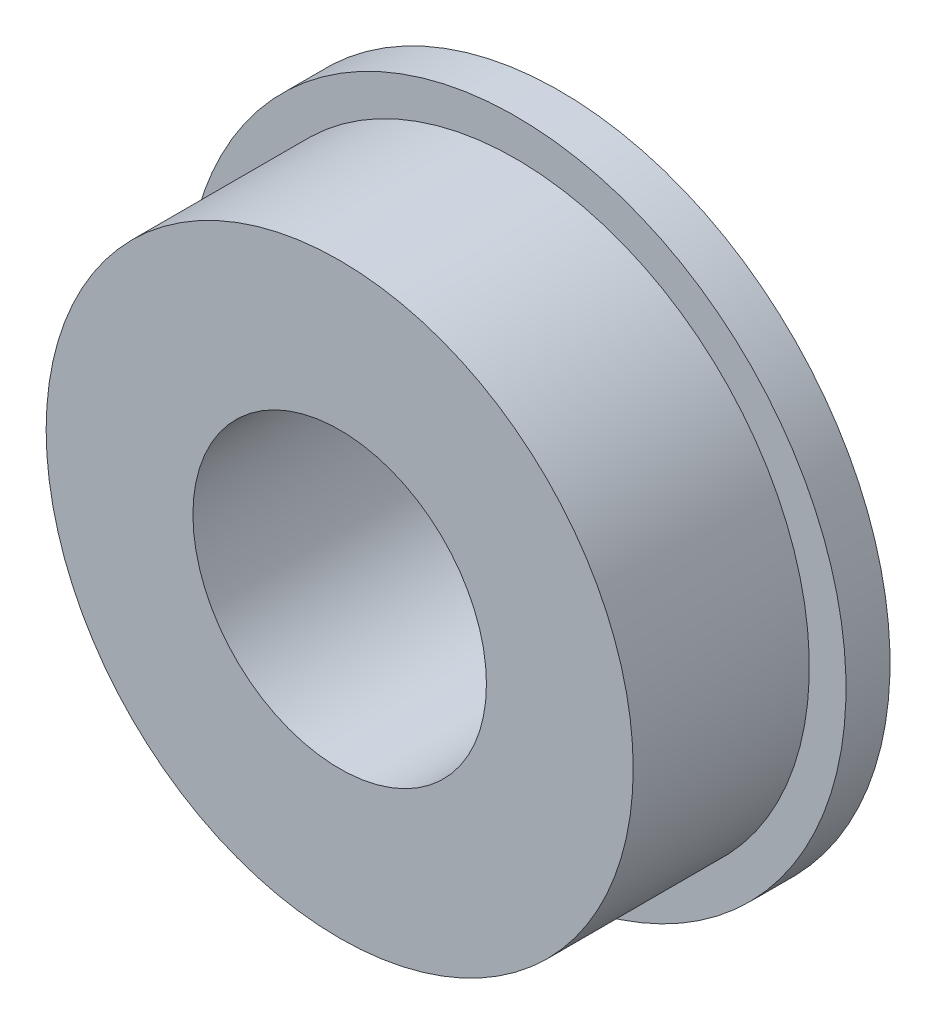
ISO-10303-21;
HEADER;
FILE_DESCRIPTION(('STEP AP214'),'2;1');
FILE_NAME('part.step','',(''),(''),'','','');
FILE_SCHEMA(('AUTOMOTIVE_DESIGN { 1 0 10303 214 1 1 1 1 }'));
ENDSEC;
DATA;
#1=APPLICATION_CONTEXT('core data for automotive mechanical design processes');
#2=APPLICATION_PROTOCOL_DEFINITION('international standard','automotive_design',2000,#1);
#3=PRODUCT_CONTEXT('',#1,'mechanical');
#4=PRODUCT('Part','Part','',(#3));
#5=PRODUCT_RELATED_PRODUCT_CATEGORY('part','',(#4));
#6=PRODUCT_DEFINITION_FORMATION('','',#4);
#7=PRODUCT_DEFINITION_CONTEXT('part definition',#1,'design');
#8=PRODUCT_DEFINITION('design','',#6,#7);
#9=PRODUCT_DEFINITION_SHAPE('','',#8);
#10=(LENGTH_UNIT() NAMED_UNIT(*) SI_UNIT(.MILLI.,.METRE.));
#11=(NAMED_UNIT(*) PLANE_ANGLE_UNIT() SI_UNIT($,.RADIAN.));
#12=(NAMED_UNIT(*) SI_UNIT($,.STERADIAN.) SOLID_ANGLE_UNIT());
#13=UNCERTAINTY_MEASURE_WITH_UNIT(LENGTH_MEASURE(1.E-05),#10,'distance_accuracy_value','');
#14=(GEOMETRIC_REPRESENTATION_CONTEXT(3) GLOBAL_UNCERTAINTY_ASSIGNED_CONTEXT((#13)) GLOBAL_UNIT_ASSIGNED_CONTEXT((#10,
#11,#12)) REPRESENTATION_CONTEXT('',''));
#15=CARTESIAN_POINT('',(0.,0.,0.));
#16=DIRECTION('',(0.,0.,1.));
#17=DIRECTION('',(1.,0.,0.));
#18=AXIS2_PLACEMENT_3D('',#15,#16,#17);
#19=CARTESIAN_POINT('',(0.,0.,3.));
#20=DIRECTION('',(0.,0.,-1.));
#21=DIRECTION('',(-1.,0.,0.));
#22=AXIS2_PLACEMENT_3D('',#19,#20,#21);
#23=CYLINDRICAL_SURFACE('',#22,4.);
#24=CARTESIAN_POINT('',(0.,0.,3.));
#25=DIRECTION('',(0.,0.,1.));
#26=DIRECTION('',(1.,0.,0.));
#27=AXIS2_PLACEMENT_3D('',#24,#25,#26);
#28=CIRCLE('',#27,4.);
#29=CARTESIAN_POINT('',(4.,0.,3.));
#30=VERTEX_POINT('',#29);
#31=EDGE_CURVE('E46',#30,#30,#28,.T.);
#32=ORIENTED_EDGE('',*,*,#31,.F.);
#33=EDGE_LOOP('',(#32));
#34=FACE_BOUND('',#33,.T.);
#35=CARTESIAN_POINT('',(0.,0.,0.6));
#36=DIRECTION('',(0.,0.,-1.));
#37=DIRECTION('',(-1.,0.,0.));
#38=AXIS2_PLACEMENT_3D('',#35,#36,#37);
#39=CIRCLE('',#38,4.);
#40=CARTESIAN_POINT('',(-4.,0.,0.6));
#41=VERTEX_POINT('',#40);
#42=EDGE_CURVE('E10',#41,#41,#39,.T.);
#43=ORIENTED_EDGE('',*,*,#42,.F.);
#44=EDGE_LOOP('',(#43));
#45=FACE_BOUND('',#44,.T.);
#46=ADVANCED_FACE('F43',(#34,#45),#23,.T.);
#47=CARTESIAN_POINT('',(0.,0.,3.));
#48=DIRECTION('',(0.,0.,1.));
#49=DIRECTION('',(1.,0.,0.));
#50=AXIS2_PLACEMENT_3D('',#47,#48,#49);
#51=PLANE('',#50);
#52=ORIENTED_EDGE('',*,*,#31,.T.);
#53=EDGE_LOOP('',(#52));
#54=FACE_BOUND('',#53,.T.);
#55=CARTESIAN_POINT('',(0.,0.,3.));
#56=DIRECTION('',(0.,0.,1.));
#57=DIRECTION('',(1.,0.,0.));
#58=AXIS2_PLACEMENT_3D('',#55,#56,#57);
#59=CIRCLE('',#58,2.);
#60=CARTESIAN_POINT('',(2.,0.,3.));
#61=VERTEX_POINT('',#60);
#62=EDGE_CURVE('E56',#61,#61,#59,.T.);
#63=ORIENTED_EDGE('',*,*,#62,.F.);
#64=EDGE_LOOP('',(#63));
#65=FACE_BOUND('',#64,.T.);
#66=ADVANCED_FACE('F91',(#54,#65),#51,.T.);
#67=CARTESIAN_POINT('',(0.,0.,0.));
#68=DIRECTION('',(0.,0.,1.));
#69=DIRECTION('',(1.,0.,0.));
#70=AXIS2_PLACEMENT_3D('',#67,#68,#69);
#71=PLANE('',#70);
#72=CARTESIAN_POINT('',(0.,0.,0.));
#73=DIRECTION('',(0.,0.,1.));
#74=DIRECTION('',(1.,0.,0.));
#75=AXIS2_PLACEMENT_3D('',#72,#73,#74);
#76=CIRCLE('',#75,2.);
#77=CARTESIAN_POINT('',(2.,0.,0.));
#78=VERTEX_POINT('',#77);
#79=EDGE_CURVE('E63',#78,#78,#76,.T.);
#80=ORIENTED_EDGE('',*,*,#79,.T.);
#81=EDGE_LOOP('',(#80));
#82=FACE_BOUND('',#81,.T.);
#83=CARTESIAN_POINT('',(0.,0.,0.));
#84=DIRECTION('',(0.,0.,-1.));
#85=DIRECTION('',(-1.,0.,0.));
#86=AXIS2_PLACEMENT_3D('',#83,#84,#85);
#87=CIRCLE('',#86,4.5);
#88=CARTESIAN_POINT('',(-4.5,0.,0.));
#89=VERTEX_POINT('',#88);
#90=EDGE_CURVE('E59',#89,#89,#87,.T.);
#91=ORIENTED_EDGE('',*,*,#90,.T.);
#92=EDGE_LOOP('',(#91));
#93=FACE_BOUND('',#92,.T.);
#94=ADVANCED_FACE('F77',(#82,#93),#71,.F.);
#95=CARTESIAN_POINT('',(0.,0.,3.));
#96=DIRECTION('',(0.,0.,-1.));
#97=DIRECTION('',(-1.,0.,0.));
#98=AXIS2_PLACEMENT_3D('',#95,#96,#97);
#99=CYLINDRICAL_SURFACE('',#98,2.);
#100=ORIENTED_EDGE('',*,*,#79,.F.);
#101=EDGE_LOOP('',(#100));
#102=FACE_BOUND('',#101,.T.);
#103=ORIENTED_EDGE('',*,*,#62,.T.);
#104=EDGE_LOOP('',(#103));
#105=FACE_BOUND('',#104,.T.);
#106=ADVANCED_FACE('F86',(#102,#105),#99,.F.);
#107=CARTESIAN_POINT('',(0.,0.,0.6));
#108=DIRECTION('',(0.,0.,-1.));
#109=DIRECTION('',(-1.,0.,0.));
#110=AXIS2_PLACEMENT_3D('',#107,#108,#109);
#111=PLANE('',#110);
#112=CARTESIAN_POINT('',(0.,0.,0.6));
#113=DIRECTION('',(0.,0.,-1.));
#114=DIRECTION('',(-1.,0.,0.));
#115=AXIS2_PLACEMENT_3D('',#112,#113,#114);
#116=CIRCLE('',#115,4.5);
#117=CARTESIAN_POINT('',(-4.5,0.,0.6));
#118=VERTEX_POINT('',#117);
#119=EDGE_CURVE('E66',#118,#118,#116,.T.);
#120=ORIENTED_EDGE('',*,*,#119,.F.);
#121=EDGE_LOOP('',(#120));
#122=FACE_BOUND('',#121,.T.);
#123=ORIENTED_EDGE('',*,*,#42,.T.);
#124=EDGE_LOOP('',(#123));
#125=FACE_BOUND('',#124,.T.);
#126=ADVANCED_FACE('F81',(#122,#125),#111,.F.);
#127=CARTESIAN_POINT('',(0.,0.,0.6));
#128=DIRECTION('',(0.,0.,-1.));
#129=DIRECTION('',(-1.,0.,0.));
#130=AXIS2_PLACEMENT_3D('',#127,#128,#129);
#131=CYLINDRICAL_SURFACE('',#130,4.5);
#132=ORIENTED_EDGE('',*,*,#119,.T.);
#133=EDGE_LOOP('',(#132));
#134=FACE_BOUND('',#133,.T.);
#135=ORIENTED_EDGE('',*,*,#90,.F.);
#136=EDGE_LOOP('',(#135));
#137=FACE_BOUND('',#136,.T.);
#138=ADVANCED_FACE('F79',(#134,#137),#131,.T.);
#139=CLOSED_SHELL('',(#46,#66,#94,#106,#126,#138));
#140=MANIFOLD_SOLID_BREP('B2',#139);
#141=ADVANCED_BREP_SHAPE_REPRESENTATION('',(#18,#140),#14);
#142=SHAPE_DEFINITION_REPRESENTATION(#9,#141);
ENDSEC;
END-ISO-10303-21;
